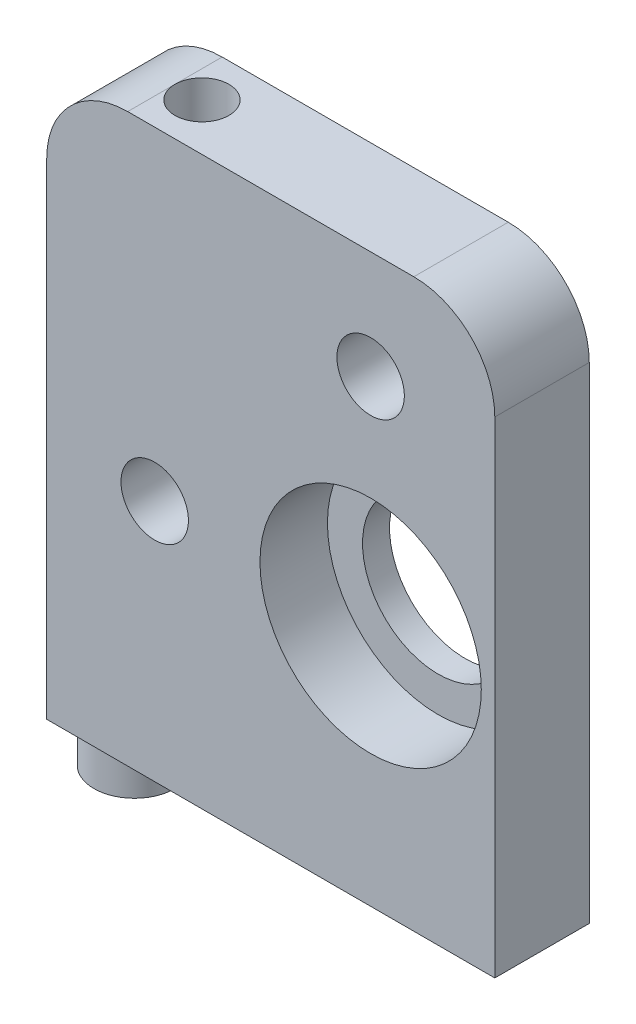
ISO-10303-21;
HEADER;
FILE_DESCRIPTION(('STEP AP214'),'2;1');
FILE_NAME('part.step','',(''),(''),'','','');
FILE_SCHEMA(('AUTOMOTIVE_DESIGN { 1 0 10303 214 1 1 1 1 }'));
ENDSEC;
DATA;
#1=APPLICATION_CONTEXT('core data for automotive mechanical design processes');
#2=APPLICATION_PROTOCOL_DEFINITION('international standard','automotive_design',2000,#1);
#3=PRODUCT_CONTEXT('',#1,'mechanical');
#4=PRODUCT('Part','Part','',(#3));
#5=PRODUCT_RELATED_PRODUCT_CATEGORY('part','',(#4));
#6=PRODUCT_DEFINITION_FORMATION('','',#4);
#7=PRODUCT_DEFINITION_CONTEXT('part definition',#1,'design');
#8=PRODUCT_DEFINITION('design','',#6,#7);
#9=PRODUCT_DEFINITION_SHAPE('','',#8);
#10=(LENGTH_UNIT() NAMED_UNIT(*) SI_UNIT(.MILLI.,.METRE.));
#11=(NAMED_UNIT(*) PLANE_ANGLE_UNIT() SI_UNIT($,.RADIAN.));
#12=(NAMED_UNIT(*) SI_UNIT($,.STERADIAN.) SOLID_ANGLE_UNIT());
#13=UNCERTAINTY_MEASURE_WITH_UNIT(LENGTH_MEASURE(1.E-05),#10,'distance_accuracy_value','');
#14=(GEOMETRIC_REPRESENTATION_CONTEXT(3) GLOBAL_UNCERTAINTY_ASSIGNED_CONTEXT((#13)) GLOBAL_UNIT_ASSIGNED_CONTEXT((#10,
#11,#12)) REPRESENTATION_CONTEXT('',''));
#15=CARTESIAN_POINT('',(0.,0.,0.));
#16=DIRECTION('',(0.,0.,1.));
#17=DIRECTION('',(1.,0.,0.));
#18=AXIS2_PLACEMENT_3D('',#15,#16,#17);
#19=CARTESIAN_POINT('',(4.6,0.,3.5));
#20=DIRECTION('',(1.,0.,0.));
#21=DIRECTION('',(0.,1.,0.));
#22=AXIS2_PLACEMENT_3D('',#19,#20,#21);
#23=PLANE('',#22);
#24=DIRECTION('',(0.,-1.,0.));
#25=VECTOR('',#24,1.);
#26=CARTESIAN_POINT('',(4.6,0.,0.));
#27=LINE('',#26,#25);
#28=CARTESIAN_POINT('',(4.6,9.,0.));
#29=VERTEX_POINT('',#28);
#30=CARTESIAN_POINT('',(4.6,-9.,0.));
#31=VERTEX_POINT('',#30);
#32=EDGE_CURVE('E187',#29,#31,#27,.T.);
#33=ORIENTED_EDGE('',*,*,#32,.F.);
#34=DIRECTION('',(0.,0.,-1.));
#35=VECTOR('',#34,1.);
#36=CARTESIAN_POINT('',(4.6,9.,3.5));
#37=LINE('',#36,#35);
#38=CARTESIAN_POINT('',(4.6,9.,3.5));
#39=VERTEX_POINT('',#38);
#40=EDGE_CURVE('E53',#29,#39,#37,.F.);
#41=ORIENTED_EDGE('',*,*,#40,.T.);
#42=DIRECTION('',(0.,-1.,0.));
#43=VECTOR('',#42,1.);
#44=CARTESIAN_POINT('',(4.6,0.,3.5));
#45=LINE('',#44,#43);
#46=CARTESIAN_POINT('',(4.6,-9.,3.5));
#47=VERTEX_POINT('',#46);
#48=EDGE_CURVE('E171',#39,#47,#45,.T.);
#49=ORIENTED_EDGE('',*,*,#48,.T.);
#50=DIRECTION('',(0.,0.,-1.));
#51=VECTOR('',#50,1.);
#52=CARTESIAN_POINT('',(4.6,-9.,3.5));
#53=LINE('',#52,#51);
#54=EDGE_CURVE('E125',#47,#31,#53,.T.);
#55=ORIENTED_EDGE('',*,*,#54,.T.);
#56=EDGE_LOOP('',(#33,#41,#49,#55));
#57=FACE_BOUND('',#56,.T.);
#58=ADVANCED_FACE('F44',(#57),#23,.T.);
#59=CARTESIAN_POINT('',(0.,12.,3.5));
#60=DIRECTION('',(0.,1.,0.));
#61=DIRECTION('',(0.,0.,1.));
#62=AXIS2_PLACEMENT_3D('',#59,#60,#61);
#63=PLANE('',#62);
#64=DIRECTION('',(0.,0.,-1.));
#65=VECTOR('',#64,1.);
#66=CARTESIAN_POINT('',(-9.,12.,3.5));
#67=LINE('',#66,#65);
#68=CARTESIAN_POINT('',(-9.,12.,0.));
#69=VERTEX_POINT('',#68);
#70=CARTESIAN_POINT('',(-9.,12.,1.75));
#71=VERTEX_POINT('',#70);
#72=EDGE_CURVE('E141',#69,#71,#67,.F.);
#73=ORIENTED_EDGE('',*,*,#72,.T.);
#74=CARTESIAN_POINT('',(-8.,12.,1.75));
#75=DIRECTION('',(0.,1.,0.));
#76=DIRECTION('',(0.,0.,1.));
#77=AXIS2_PLACEMENT_3D('',#74,#75,#76);
#78=CIRCLE('',#77,1.);
#79=EDGE_CURVE('E58',#71,#71,#78,.T.);
#80=ORIENTED_EDGE('',*,*,#79,.F.);
#81=CARTESIAN_POINT('',(-9.,12.,3.5));
#82=VERTEX_POINT('',#81);
#83=EDGE_CURVE('E140',#71,#82,#67,.F.);
#84=ORIENTED_EDGE('',*,*,#83,.T.);
#85=DIRECTION('',(1.,0.,0.));
#86=VECTOR('',#85,1.);
#87=CARTESIAN_POINT('',(0.,12.,3.5));
#88=LINE('',#87,#86);
#89=CARTESIAN_POINT('',(1.6,12.,3.5));
#90=VERTEX_POINT('',#89);
#91=EDGE_CURVE('E161',#82,#90,#88,.T.);
#92=ORIENTED_EDGE('',*,*,#91,.T.);
#93=DIRECTION('',(0.,0.,-1.));
#94=VECTOR('',#93,1.);
#95=CARTESIAN_POINT('',(1.6,12.,3.5));
#96=LINE('',#95,#94);
#97=CARTESIAN_POINT('',(1.6,12.,0.));
#98=VERTEX_POINT('',#97);
#99=EDGE_CURVE('E148',#90,#98,#96,.T.);
#100=ORIENTED_EDGE('',*,*,#99,.T.);
#101=DIRECTION('',(1.,0.,0.));
#102=VECTOR('',#101,1.);
#103=CARTESIAN_POINT('',(0.,12.,0.));
#104=LINE('',#103,#102);
#105=EDGE_CURVE('E182',#69,#98,#104,.T.);
#106=ORIENTED_EDGE('',*,*,#105,.F.);
#107=EDGE_LOOP('',(#73,#80,#84,#92,#100,#106));
#108=FACE_BOUND('',#107,.T.);
#109=ADVANCED_FACE('F160',(#108),#63,.T.);
#110=CARTESIAN_POINT('',(-12.,0.,3.5));
#111=DIRECTION('',(1.,0.,0.));
#112=DIRECTION('',(0.,1.,0.));
#113=AXIS2_PLACEMENT_3D('',#110,#111,#112);
#114=PLANE('',#113);
#115=DIRECTION('',(0.,-1.,0.));
#116=VECTOR('',#115,1.);
#117=CARTESIAN_POINT('',(-12.,0.,3.5));
#118=LINE('',#117,#116);
#119=CARTESIAN_POINT('',(-12.,9.,3.5));
#120=VERTEX_POINT('',#119);
#121=CARTESIAN_POINT('',(-12.,-9.,3.5));
#122=VERTEX_POINT('',#121);
#123=EDGE_CURVE('E170',#120,#122,#118,.T.);
#124=ORIENTED_EDGE('',*,*,#123,.F.);
#125=DIRECTION('',(0.,0.,-1.));
#126=VECTOR('',#125,1.);
#127=CARTESIAN_POINT('',(-12.,9.,0.));
#128=LINE('',#127,#126);
#129=CARTESIAN_POINT('',(-12.,9.,0.));
#130=VERTEX_POINT('',#129);
#131=EDGE_CURVE('E134',#120,#130,#128,.T.);
#132=ORIENTED_EDGE('',*,*,#131,.T.);
#133=DIRECTION('',(0.,-1.,0.));
#134=VECTOR('',#133,1.);
#135=CARTESIAN_POINT('',(-12.,0.,0.));
#136=LINE('',#135,#134);
#137=CARTESIAN_POINT('',(-12.,-9.,0.));
#138=VERTEX_POINT('',#137);
#139=EDGE_CURVE('E121',#130,#138,#136,.T.);
#140=ORIENTED_EDGE('',*,*,#139,.T.);
#141=DIRECTION('',(0.,0.,-1.));
#142=VECTOR('',#141,1.);
#143=CARTESIAN_POINT('',(-12.,-9.,3.5));
#144=LINE('',#143,#142);
#145=CARTESIAN_POINT('',(-12.,-9.,1.75));
#146=VERTEX_POINT('',#145);
#147=EDGE_CURVE('E115',#146,#138,#144,.T.);
#148=ORIENTED_EDGE('',*,*,#147,.F.);
#149=EDGE_CURVE('E103',#122,#146,#144,.T.);
#150=ORIENTED_EDGE('',*,*,#149,.F.);
#151=EDGE_LOOP('',(#124,#132,#140,#148,#150));
#152=FACE_BOUND('',#151,.T.);
#153=ADVANCED_FACE('F118',(#152),#114,.F.);
#154=CARTESIAN_POINT('',(0.,0.,3.5));
#155=DIRECTION('',(0.,0.,-1.));
#156=DIRECTION('',(-1.,0.,0.));
#157=AXIS2_PLACEMENT_3D('',#154,#155,#156);
#158=CYLINDRICAL_SURFACE('',#157,4.1);
#159=CARTESIAN_POINT('',(0.,0.,1.));
#160=DIRECTION('',(0.,0.,1.));
#161=DIRECTION('',(1.,0.,0.));
#162=AXIS2_PLACEMENT_3D('',#159,#160,#161);
#163=CIRCLE('',#162,4.1);
#164=CARTESIAN_POINT('',(4.1,0.,1.));
#165=VERTEX_POINT('',#164);
#166=EDGE_CURVE('E114',#165,#165,#163,.T.);
#167=ORIENTED_EDGE('',*,*,#166,.F.);
#168=EDGE_LOOP('',(#167));
#169=FACE_BOUND('',#168,.T.);
#170=CARTESIAN_POINT('',(0.,0.,3.5));
#171=DIRECTION('',(0.,0.,1.));
#172=DIRECTION('',(1.,0.,0.));
#173=AXIS2_PLACEMENT_3D('',#170,#171,#172);
#174=CIRCLE('',#173,4.1);
#175=CARTESIAN_POINT('',(4.1,0.,3.5));
#176=VERTEX_POINT('',#175);
#177=EDGE_CURVE('E207',#176,#176,#174,.T.);
#178=ORIENTED_EDGE('',*,*,#177,.T.);
#179=EDGE_LOOP('',(#178));
#180=FACE_BOUND('',#179,.T.);
#181=ADVANCED_FACE('F269',(#169,#180),#158,.F.);
#182=CARTESIAN_POINT('',(0.,8.,3.5));
#183=DIRECTION('',(0.,0.,-1.));
#184=DIRECTION('',(-1.,0.,0.));
#185=AXIS2_PLACEMENT_3D('',#182,#183,#184);
#186=CYLINDRICAL_SURFACE('',#185,1.25);
#187=CARTESIAN_POINT('',(0.,8.,3.5));
#188=DIRECTION('',(0.,0.,1.));
#189=DIRECTION('',(1.,0.,0.));
#190=AXIS2_PLACEMENT_3D('',#187,#188,#189);
#191=CIRCLE('',#190,1.25);
#192=CARTESIAN_POINT('',(1.25,8.,3.5));
#193=VERTEX_POINT('',#192);
#194=EDGE_CURVE('E211',#193,#193,#191,.T.);
#195=ORIENTED_EDGE('',*,*,#194,.T.);
#196=EDGE_LOOP('',(#195));
#197=FACE_BOUND('',#196,.T.);
#198=CARTESIAN_POINT('',(0.,8.,0.));
#199=DIRECTION('',(0.,0.,1.));
#200=DIRECTION('',(1.,0.,0.));
#201=AXIS2_PLACEMENT_3D('',#198,#199,#200);
#202=CIRCLE('',#201,1.25);
#203=CARTESIAN_POINT('',(1.25,8.,0.));
#204=VERTEX_POINT('',#203);
#205=EDGE_CURVE('E192',#204,#204,#202,.T.);
#206=ORIENTED_EDGE('',*,*,#205,.F.);
#207=EDGE_LOOP('',(#206));
#208=FACE_BOUND('',#207,.T.);
#209=ADVANCED_FACE('F272',(#197,#208),#186,.F.);
#210=CARTESIAN_POINT('',(-8.,0.,3.5));
#211=DIRECTION('',(0.,0.,-1.));
#212=DIRECTION('',(-1.,0.,0.));
#213=AXIS2_PLACEMENT_3D('',#210,#211,#212);
#214=CYLINDRICAL_SURFACE('',#213,1.25);
#215=CARTESIAN_POINT('',(-8.,0.,3.5));
#216=DIRECTION('',(0.,0.,1.));
#217=DIRECTION('',(1.,0.,0.));
#218=AXIS2_PLACEMENT_3D('',#215,#216,#217);
#219=CIRCLE('',#218,1.25);
#220=CARTESIAN_POINT('',(-6.75,0.,3.5));
#221=VERTEX_POINT('',#220);
#222=EDGE_CURVE('E186',#221,#221,#219,.T.);
#223=ORIENTED_EDGE('',*,*,#222,.T.);
#224=EDGE_LOOP('',(#223));
#225=FACE_BOUND('',#224,.T.);
#226=CARTESIAN_POINT('',(-8.,0.,0.));
#227=DIRECTION('',(0.,0.,1.));
#228=DIRECTION('',(1.,0.,0.));
#229=AXIS2_PLACEMENT_3D('',#226,#227,#228);
#230=CIRCLE('',#229,1.25);
#231=CARTESIAN_POINT('',(-6.75,0.,0.));
#232=VERTEX_POINT('',#231);
#233=EDGE_CURVE('E196',#232,#232,#230,.T.);
#234=ORIENTED_EDGE('',*,*,#233,.F.);
#235=EDGE_LOOP('',(#234));
#236=FACE_BOUND('',#235,.T.);
#237=ADVANCED_FACE('F276',(#225,#236),#214,.F.);
#238=CARTESIAN_POINT('',(0.,-9.,3.5));
#239=DIRECTION('',(0.,1.,0.));
#240=DIRECTION('',(0.,0.,1.));
#241=AXIS2_PLACEMENT_3D('',#238,#239,#240);
#242=PLANE('',#241);
#243=CARTESIAN_POINT('',(-4.5,-9.,1.75));
#244=DIRECTION('',(0.,-1.,0.));
#245=DIRECTION('',(0.,0.,-1.));
#246=AXIS2_PLACEMENT_3D('',#243,#244,#245);
#247=CIRCLE('',#246,1.);
#248=CARTESIAN_POINT('',(-4.5,-9.,0.75));
#249=VERTEX_POINT('',#248);
#250=EDGE_CURVE('E226',#249,#249,#247,.T.);
#251=ORIENTED_EDGE('',*,*,#250,.F.);
#252=EDGE_LOOP('',(#251));
#253=FACE_BOUND('',#252,.T.);
#254=ORIENTED_EDGE('',*,*,#149,.T.);
#255=CARTESIAN_POINT('',(-10.5,-9.,1.75));
#256=DIRECTION('',(0.,-1.,0.));
#257=DIRECTION('',(0.,0.,-1.));
#258=AXIS2_PLACEMENT_3D('',#255,#256,#257);
#259=CIRCLE('',#258,1.5);
#260=EDGE_CURVE('E107',#146,#146,#259,.T.);
#261=ORIENTED_EDGE('',*,*,#260,.F.);
#262=ORIENTED_EDGE('',*,*,#147,.T.);
#263=DIRECTION('',(1.,0.,0.));
#264=VECTOR('',#263,1.);
#265=CARTESIAN_POINT('',(0.,-9.,0.));
#266=LINE('',#265,#264);
#267=EDGE_CURVE('E180',#138,#31,#266,.T.);
#268=ORIENTED_EDGE('',*,*,#267,.T.);
#269=ORIENTED_EDGE('',*,*,#54,.F.);
#270=DIRECTION('',(1.,0.,0.));
#271=VECTOR('',#270,1.);
#272=CARTESIAN_POINT('',(0.,-9.,3.5));
#273=LINE('',#272,#271);
#274=EDGE_CURVE('E110',#122,#47,#273,.T.);
#275=ORIENTED_EDGE('',*,*,#274,.F.);
#276=EDGE_LOOP('',(#254,#261,#262,#268,#269,#275));
#277=FACE_BOUND('',#276,.T.);
#278=ADVANCED_FACE('F105',(#253,#277),#242,.F.);
#279=CARTESIAN_POINT('',(0.,0.,3.5));
#280=DIRECTION('',(0.,0.,1.));
#281=DIRECTION('',(1.,0.,0.));
#282=AXIS2_PLACEMENT_3D('',#279,#280,#281);
#283=PLANE('',#282);
#284=ORIENTED_EDGE('',*,*,#222,.F.);
#285=EDGE_LOOP('',(#284));
#286=FACE_BOUND('',#285,.T.);
#287=ORIENTED_EDGE('',*,*,#194,.F.);
#288=EDGE_LOOP('',(#287));
#289=FACE_BOUND('',#288,.T.);
#290=ORIENTED_EDGE('',*,*,#177,.F.);
#291=EDGE_LOOP('',(#290));
#292=FACE_BOUND('',#291,.T.);
#293=ORIENTED_EDGE('',*,*,#48,.F.);
#294=CARTESIAN_POINT('',(1.6,9.,3.5));
#295=DIRECTION('',(0.,0.,1.));
#296=DIRECTION('',(1.,0.,0.));
#297=AXIS2_PLACEMENT_3D('',#294,#295,#296);
#298=CIRCLE('',#297,3.);
#299=EDGE_CURVE('E11',#39,#90,#298,.T.);
#300=ORIENTED_EDGE('',*,*,#299,.T.);
#301=ORIENTED_EDGE('',*,*,#91,.F.);
#302=CARTESIAN_POINT('',(-9.,9.,3.5));
#303=DIRECTION('',(0.,0.,1.));
#304=DIRECTION('',(1.,0.,0.));
#305=AXIS2_PLACEMENT_3D('',#302,#303,#304);
#306=CIRCLE('',#305,3.);
#307=EDGE_CURVE('E145',#82,#120,#306,.T.);
#308=ORIENTED_EDGE('',*,*,#307,.T.);
#309=ORIENTED_EDGE('',*,*,#123,.T.);
#310=ORIENTED_EDGE('',*,*,#274,.T.);
#311=EDGE_LOOP('',(#293,#300,#301,#308,#309,#310));
#312=FACE_BOUND('',#311,.T.);
#313=ADVANCED_FACE('F167',(#286,#289,#292,#312),#283,.T.);
#314=CARTESIAN_POINT('',(0.,0.,0.));
#315=DIRECTION('',(0.,0.,1.));
#316=DIRECTION('',(1.,0.,0.));
#317=AXIS2_PLACEMENT_3D('',#314,#315,#316);
#318=PLANE('',#317);
#319=ORIENTED_EDGE('',*,*,#233,.T.);
#320=EDGE_LOOP('',(#319));
#321=FACE_BOUND('',#320,.T.);
#322=ORIENTED_EDGE('',*,*,#205,.T.);
#323=EDGE_LOOP('',(#322));
#324=FACE_BOUND('',#323,.T.);
#325=ORIENTED_EDGE('',*,*,#105,.T.);
#326=CARTESIAN_POINT('',(1.6,9.,0.));
#327=DIRECTION('',(0.,0.,1.));
#328=DIRECTION('',(1.,0.,0.));
#329=AXIS2_PLACEMENT_3D('',#326,#327,#328);
#330=CIRCLE('',#329,3.);
#331=EDGE_CURVE('E152',#98,#29,#330,.F.);
#332=ORIENTED_EDGE('',*,*,#331,.T.);
#333=ORIENTED_EDGE('',*,*,#32,.T.);
#334=ORIENTED_EDGE('',*,*,#267,.F.);
#335=ORIENTED_EDGE('',*,*,#139,.F.);
#336=CARTESIAN_POINT('',(-9.,9.,0.));
#337=DIRECTION('',(0.,0.,1.));
#338=DIRECTION('',(1.,0.,0.));
#339=AXIS2_PLACEMENT_3D('',#336,#337,#338);
#340=CIRCLE('',#339,3.);
#341=EDGE_CURVE('E137',#130,#69,#340,.F.);
#342=ORIENTED_EDGE('',*,*,#341,.T.);
#343=EDGE_LOOP('',(#325,#332,#333,#334,#335,#342));
#344=FACE_BOUND('',#343,.T.);
#345=CARTESIAN_POINT('',(0.,0.,0.));
#346=DIRECTION('',(0.,0.,1.));
#347=DIRECTION('',(1.,0.,0.));
#348=AXIS2_PLACEMENT_3D('',#345,#346,#347);
#349=CIRCLE('',#348,2.8);
#350=CARTESIAN_POINT('',(2.8,0.,0.));
#351=VERTEX_POINT('',#350);
#352=EDGE_CURVE('E218',#351,#351,#349,.T.);
#353=ORIENTED_EDGE('',*,*,#352,.T.);
#354=EDGE_LOOP('',(#353));
#355=FACE_BOUND('',#354,.T.);
#356=ADVANCED_FACE('F177',(#321,#324,#344,#355),#318,.F.);
#357=CARTESIAN_POINT('',(0.,0.,1.));
#358=DIRECTION('',(0.,0.,-1.));
#359=DIRECTION('',(-1.,0.,0.));
#360=AXIS2_PLACEMENT_3D('',#357,#358,#359);
#361=CYLINDRICAL_SURFACE('',#360,2.8);
#362=CARTESIAN_POINT('',(0.,0.,1.));
#363=DIRECTION('',(0.,0.,1.));
#364=DIRECTION('',(1.,0.,0.));
#365=AXIS2_PLACEMENT_3D('',#362,#363,#364);
#366=CIRCLE('',#365,2.8);
#367=CARTESIAN_POINT('',(2.8,0.,1.));
#368=VERTEX_POINT('',#367);
#369=EDGE_CURVE('E200',#368,#368,#366,.T.);
#370=ORIENTED_EDGE('',*,*,#369,.T.);
#371=EDGE_LOOP('',(#370));
#372=FACE_BOUND('',#371,.T.);
#373=ORIENTED_EDGE('',*,*,#352,.F.);
#374=EDGE_LOOP('',(#373));
#375=FACE_BOUND('',#374,.T.);
#376=ADVANCED_FACE('F288',(#372,#375),#361,.F.);
#377=CARTESIAN_POINT('',(0.,0.,1.));
#378=DIRECTION('',(0.,0.,1.));
#379=DIRECTION('',(1.,0.,0.));
#380=AXIS2_PLACEMENT_3D('',#377,#378,#379);
#381=PLANE('',#380);
#382=ORIENTED_EDGE('',*,*,#369,.F.);
#383=EDGE_LOOP('',(#382));
#384=FACE_BOUND('',#383,.T.);
#385=ORIENTED_EDGE('',*,*,#166,.T.);
#386=EDGE_LOOP('',(#385));
#387=FACE_BOUND('',#386,.T.);
#388=ADVANCED_FACE('F281',(#384,#387),#381,.T.);
#389=CARTESIAN_POINT('',(-9.,9.,3.5));
#390=DIRECTION('',(0.,0.,1.));
#391=DIRECTION('',(1.,0.,0.));
#392=AXIS2_PLACEMENT_3D('',#389,#390,#391);
#393=CYLINDRICAL_SURFACE('',#392,3.);
#394=ORIENTED_EDGE('',*,*,#307,.F.);
#395=ORIENTED_EDGE('',*,*,#83,.F.);
#396=ORIENTED_EDGE('',*,*,#72,.F.);
#397=ORIENTED_EDGE('',*,*,#341,.F.);
#398=ORIENTED_EDGE('',*,*,#131,.F.);
#399=EDGE_LOOP('',(#394,#395,#396,#397,#398));
#400=FACE_BOUND('',#399,.T.);
#401=ADVANCED_FACE('F174',(#400),#393,.T.);
#402=CARTESIAN_POINT('',(1.6,9.,3.5));
#403=DIRECTION('',(0.,0.,-1.));
#404=DIRECTION('',(-1.,0.,0.));
#405=AXIS2_PLACEMENT_3D('',#402,#403,#404);
#406=CYLINDRICAL_SURFACE('',#405,3.);
#407=ORIENTED_EDGE('',*,*,#299,.F.);
#408=ORIENTED_EDGE('',*,*,#40,.F.);
#409=ORIENTED_EDGE('',*,*,#331,.F.);
#410=ORIENTED_EDGE('',*,*,#99,.F.);
#411=EDGE_LOOP('',(#407,#408,#409,#410));
#412=FACE_BOUND('',#411,.T.);
#413=ADVANCED_FACE('F46',(#412),#406,.T.);
#414=CARTESIAN_POINT('',(-4.5,-3.,1.75));
#415=DIRECTION('',(0.,-1.,0.));
#416=DIRECTION('',(0.,0.,-1.));
#417=AXIS2_PLACEMENT_3D('',#414,#415,#416);
#418=CYLINDRICAL_SURFACE('',#417,1.);
#419=CARTESIAN_POINT('',(-4.5,-3.,1.75));
#420=DIRECTION('',(0.,-1.,0.));
#421=DIRECTION('',(0.,0.,-1.));
#422=AXIS2_PLACEMENT_3D('',#419,#420,#421);
#423=CIRCLE('',#422,1.);
#424=CARTESIAN_POINT('',(-4.5,-3.,0.75));
#425=VERTEX_POINT('',#424);
#426=EDGE_CURVE('E222',#425,#425,#423,.T.);
#427=ORIENTED_EDGE('',*,*,#426,.F.);
#428=EDGE_LOOP('',(#427));
#429=FACE_BOUND('',#428,.T.);
#430=ORIENTED_EDGE('',*,*,#250,.T.);
#431=EDGE_LOOP('',(#430));
#432=FACE_BOUND('',#431,.T.);
#433=ADVANCED_FACE('F285',(#429,#432),#418,.F.);
#434=CARTESIAN_POINT('',(0.,-3.,0.));
#435=DIRECTION('',(0.,-1.,0.));
#436=DIRECTION('',(0.,0.,-1.));
#437=AXIS2_PLACEMENT_3D('',#434,#435,#436);
#438=PLANE('',#437);
#439=ORIENTED_EDGE('',*,*,#426,.T.);
#440=EDGE_LOOP('',(#439));
#441=FACE_BOUND('',#440,.T.);
#442=ADVANCED_FACE('F413',(#441),#438,.T.);
#443=CARTESIAN_POINT('',(-10.5,-10.6,1.75));
#444=DIRECTION('',(0.,1.,0.));
#445=DIRECTION('',(0.,0.,1.));
#446=AXIS2_PLACEMENT_3D('',#443,#444,#445);
#447=CYLINDRICAL_SURFACE('',#446,1.5);
#448=CARTESIAN_POINT('',(-10.5,-10.6,1.75));
#449=DIRECTION('',(0.,-1.,0.));
#450=DIRECTION('',(0.,0.,-1.));
#451=AXIS2_PLACEMENT_3D('',#448,#449,#450);
#452=CIRCLE('',#451,1.5);
#453=CARTESIAN_POINT('',(-10.5,-10.6,0.249999999999999));
#454=VERTEX_POINT('',#453);
#455=EDGE_CURVE('E230',#454,#454,#452,.T.);
#456=ORIENTED_EDGE('',*,*,#455,.F.);
#457=EDGE_LOOP('',(#456));
#458=FACE_BOUND('',#457,.T.);
#459=ORIENTED_EDGE('',*,*,#260,.T.);
#460=EDGE_LOOP('',(#459));
#461=FACE_BOUND('',#460,.T.);
#462=ADVANCED_FACE('F257',(#458,#461),#447,.T.);
#463=CARTESIAN_POINT('',(0.,-10.6,0.));
#464=DIRECTION('',(0.,-1.,0.));
#465=DIRECTION('',(0.,0.,-1.));
#466=AXIS2_PLACEMENT_3D('',#463,#464,#465);
#467=PLANE('',#466);
#468=ORIENTED_EDGE('',*,*,#455,.T.);
#469=EDGE_LOOP('',(#468));
#470=FACE_BOUND('',#469,.T.);
#471=ADVANCED_FACE('F250',(#470),#467,.T.);
#472=CARTESIAN_POINT('',(-8.,6.,1.75));
#473=DIRECTION('',(0.,1.,0.));
#474=DIRECTION('',(0.,0.,1.));
#475=AXIS2_PLACEMENT_3D('',#472,#473,#474);
#476=CYLINDRICAL_SURFACE('',#475,1.);
#477=CARTESIAN_POINT('',(-8.,6.,1.75));
#478=DIRECTION('',(0.,1.,0.));
#479=DIRECTION('',(0.,0.,1.));
#480=AXIS2_PLACEMENT_3D('',#477,#478,#479);
#481=CIRCLE('',#480,1.);
#482=CARTESIAN_POINT('',(-8.,6.,2.75));
#483=VERTEX_POINT('',#482);
#484=EDGE_CURVE('E236',#483,#483,#481,.T.);
#485=ORIENTED_EDGE('',*,*,#484,.F.);
#486=EDGE_LOOP('',(#485));
#487=FACE_BOUND('',#486,.T.);
#488=ORIENTED_EDGE('',*,*,#79,.T.);
#489=EDGE_LOOP('',(#488));
#490=FACE_BOUND('',#489,.T.);
#491=ADVANCED_FACE('F248',(#487,#490),#476,.F.);
#492=CARTESIAN_POINT('',(-8.,6.,1.75));
#493=DIRECTION('',(0.,1.,0.));
#494=DIRECTION('',(0.,0.,1.));
#495=AXIS2_PLACEMENT_3D('',#492,#493,#494);
#496=PLANE('',#495);
#497=ORIENTED_EDGE('',*,*,#484,.T.);
#498=EDGE_LOOP('',(#497));
#499=FACE_BOUND('',#498,.T.);
#500=ADVANCED_FACE('F246',(#499),#496,.T.);
#501=CLOSED_SHELL('',(#58,#109,#153,#181,#209,#237,#278,#313,#356,#376,#388,#401,#413,#433,#442,
#462,#471,#491,#500));
#502=MANIFOLD_SOLID_BREP('B2',#501);
#503=ADVANCED_BREP_SHAPE_REPRESENTATION('',(#18,#502),#14);
#504=SHAPE_DEFINITION_REPRESENTATION(#9,#503);
ENDSEC;
END-ISO-10303-21;
